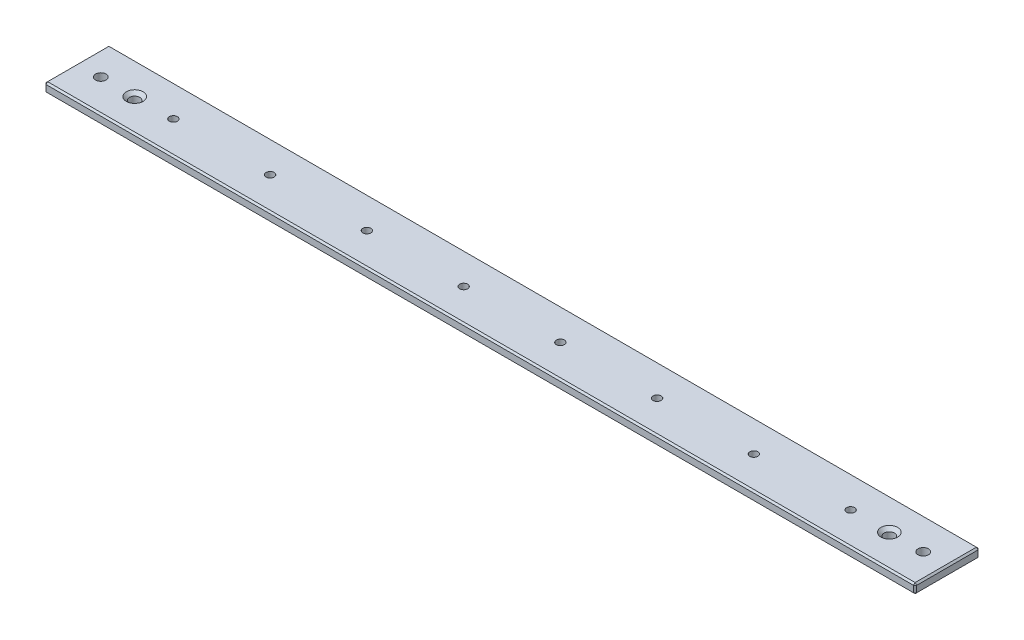
ISO-10303-21;
HEADER;
FILE_DESCRIPTION(('STEP AP214'),'2;1');
FILE_NAME('part.step','',(''),(''),'','','');
FILE_SCHEMA(('AUTOMOTIVE_DESIGN { 1 0 10303 214 1 1 1 1 }'));
ENDSEC;
DATA;
#1=APPLICATION_CONTEXT('core data for automotive mechanical design processes');
#2=APPLICATION_PROTOCOL_DEFINITION('international standard','automotive_design',2000,#1);
#3=PRODUCT_CONTEXT('',#1,'mechanical');
#4=PRODUCT('Part','Part','',(#3));
#5=PRODUCT_RELATED_PRODUCT_CATEGORY('part','',(#4));
#6=PRODUCT_DEFINITION_FORMATION('','',#4);
#7=PRODUCT_DEFINITION_CONTEXT('part definition',#1,'design');
#8=PRODUCT_DEFINITION('design','',#6,#7);
#9=PRODUCT_DEFINITION_SHAPE('','',#8);
#10=(LENGTH_UNIT() NAMED_UNIT(*) SI_UNIT(.MILLI.,.METRE.));
#11=(NAMED_UNIT(*) PLANE_ANGLE_UNIT() SI_UNIT($,.RADIAN.));
#12=(NAMED_UNIT(*) SI_UNIT($,.STERADIAN.) SOLID_ANGLE_UNIT());
#13=UNCERTAINTY_MEASURE_WITH_UNIT(LENGTH_MEASURE(1.E-05),#10,'distance_accuracy_value','');
#14=(GEOMETRIC_REPRESENTATION_CONTEXT(3) GLOBAL_UNCERTAINTY_ASSIGNED_CONTEXT((#13)) GLOBAL_UNIT_ASSIGNED_CONTEXT((#10,
#11,#12)) REPRESENTATION_CONTEXT('',''));
#15=CARTESIAN_POINT('',(0.,0.,0.));
#16=DIRECTION('',(0.,0.,1.));
#17=DIRECTION('',(1.,0.,0.));
#18=AXIS2_PLACEMENT_3D('',#15,#16,#17);
#19=CARTESIAN_POINT('',(135.,3.,-10.));
#20=DIRECTION('',(-1.,0.,0.));
#21=DIRECTION('',(0.,0.,1.));
#22=AXIS2_PLACEMENT_3D('',#19,#20,#21);
#23=PLANE('',#22);
#24=DIRECTION('',(0.,-1.,0.));
#25=VECTOR('',#24,1.);
#26=CARTESIAN_POINT('',(135.,3.,9.5));
#27=LINE('',#26,#25);
#28=CARTESIAN_POINT('',(135.,2.5,9.5));
#29=VERTEX_POINT('',#28);
#30=CARTESIAN_POINT('',(135.,0.5,9.5));
#31=VERTEX_POINT('',#30);
#32=EDGE_CURVE('E176',#29,#31,#27,.T.);
#33=ORIENTED_EDGE('',*,*,#32,.T.);
#34=DIRECTION('',(0.,0.,-1.));
#35=VECTOR('',#34,1.);
#36=CARTESIAN_POINT('',(135.,0.5,-10.));
#37=LINE('',#36,#35);
#38=CARTESIAN_POINT('',(135.,0.5,-9.5));
#39=VERTEX_POINT('',#38);
#40=EDGE_CURVE('E181',#31,#39,#37,.T.);
#41=ORIENTED_EDGE('',*,*,#40,.T.);
#42=DIRECTION('',(0.,1.,0.));
#43=VECTOR('',#42,1.);
#44=CARTESIAN_POINT('',(135.,3.,-9.5));
#45=LINE('',#44,#43);
#46=CARTESIAN_POINT('',(135.,2.5,-9.5));
#47=VERTEX_POINT('',#46);
#48=EDGE_CURVE('E178',#39,#47,#45,.T.);
#49=ORIENTED_EDGE('',*,*,#48,.T.);
#50=DIRECTION('',(0.,0.,1.));
#51=VECTOR('',#50,1.);
#52=CARTESIAN_POINT('',(135.,2.5,10.));
#53=LINE('',#52,#51);
#54=EDGE_CURVE('E174',#47,#29,#53,.T.);
#55=ORIENTED_EDGE('',*,*,#54,.T.);
#56=EDGE_LOOP('',(#33,#41,#49,#55));
#57=FACE_BOUND('',#56,.T.);
#58=ADVANCED_FACE('F38',(#57),#23,.F.);
#59=CARTESIAN_POINT('',(-135.,3.,-10.));
#60=DIRECTION('',(0.,0.,1.));
#61=DIRECTION('',(1.,0.,0.));
#62=AXIS2_PLACEMENT_3D('',#59,#60,#61);
#63=PLANE('',#62);
#64=DIRECTION('',(0.,-1.,0.));
#65=VECTOR('',#64,1.);
#66=CARTESIAN_POINT('',(134.5,3.,-10.));
#67=LINE('',#66,#65);
#68=CARTESIAN_POINT('',(134.5,2.5,-10.));
#69=VERTEX_POINT('',#68);
#70=CARTESIAN_POINT('',(134.5,0.5,-10.));
#71=VERTEX_POINT('',#70);
#72=EDGE_CURVE('E139',#69,#71,#67,.T.);
#73=ORIENTED_EDGE('',*,*,#72,.T.);
#74=DIRECTION('',(-1.,0.,0.));
#75=VECTOR('',#74,1.);
#76=CARTESIAN_POINT('',(-135.,0.5,-10.));
#77=LINE('',#76,#75);
#78=CARTESIAN_POINT('',(-134.5,0.5,-10.));
#79=VERTEX_POINT('',#78);
#80=EDGE_CURVE('E135',#71,#79,#77,.T.);
#81=ORIENTED_EDGE('',*,*,#80,.T.);
#82=DIRECTION('',(0.,1.,0.));
#83=VECTOR('',#82,1.);
#84=CARTESIAN_POINT('',(-134.5,3.,-10.));
#85=LINE('',#84,#83);
#86=CARTESIAN_POINT('',(-134.5,2.5,-10.));
#87=VERTEX_POINT('',#86);
#88=EDGE_CURVE('E127',#79,#87,#85,.T.);
#89=ORIENTED_EDGE('',*,*,#88,.T.);
#90=DIRECTION('',(1.,0.,0.));
#91=VECTOR('',#90,1.);
#92=CARTESIAN_POINT('',(135.,2.5,-10.));
#93=LINE('',#92,#91);
#94=EDGE_CURVE('E132',#87,#69,#93,.T.);
#95=ORIENTED_EDGE('',*,*,#94,.T.);
#96=EDGE_LOOP('',(#73,#81,#89,#95));
#97=FACE_BOUND('',#96,.T.);
#98=ADVANCED_FACE('F130',(#97),#63,.F.);
#99=CARTESIAN_POINT('',(-135.,3.,-10.));
#100=DIRECTION('',(1.,0.,0.));
#101=DIRECTION('',(0.,0.,-1.));
#102=AXIS2_PLACEMENT_3D('',#99,#100,#101);
#103=PLANE('',#102);
#104=DIRECTION('',(0.,0.,-1.));
#105=VECTOR('',#104,1.);
#106=CARTESIAN_POINT('',(-135.,2.5,-10.));
#107=LINE('',#106,#105);
#108=CARTESIAN_POINT('',(-135.,2.5,9.5));
#109=VERTEX_POINT('',#108);
#110=CARTESIAN_POINT('',(-135.,2.5,-9.5));
#111=VERTEX_POINT('',#110);
#112=EDGE_CURVE('E192',#109,#111,#107,.T.);
#113=ORIENTED_EDGE('',*,*,#112,.T.);
#114=DIRECTION('',(0.,-1.,0.));
#115=VECTOR('',#114,1.);
#116=CARTESIAN_POINT('',(-135.,3.,-9.5));
#117=LINE('',#116,#115);
#118=CARTESIAN_POINT('',(-135.,0.5,-9.5));
#119=VERTEX_POINT('',#118);
#120=EDGE_CURVE('E147',#111,#119,#117,.T.);
#121=ORIENTED_EDGE('',*,*,#120,.T.);
#122=DIRECTION('',(0.,0.,1.));
#123=VECTOR('',#122,1.);
#124=CARTESIAN_POINT('',(-135.,0.5,-10.));
#125=LINE('',#124,#123);
#126=CARTESIAN_POINT('',(-135.,0.5,9.5));
#127=VERTEX_POINT('',#126);
#128=EDGE_CURVE('E196',#119,#127,#125,.T.);
#129=ORIENTED_EDGE('',*,*,#128,.T.);
#130=DIRECTION('',(0.,1.,0.));
#131=VECTOR('',#130,1.);
#132=CARTESIAN_POINT('',(-135.,3.,9.5));
#133=LINE('',#132,#131);
#134=EDGE_CURVE('E194',#127,#109,#133,.T.);
#135=ORIENTED_EDGE('',*,*,#134,.T.);
#136=EDGE_LOOP('',(#113,#121,#129,#135));
#137=FACE_BOUND('',#136,.T.);
#138=ADVANCED_FACE('F366',(#137),#103,.F.);
#139=CARTESIAN_POINT('',(-135.,3.,10.));
#140=DIRECTION('',(0.,0.,-1.));
#141=DIRECTION('',(-1.,0.,0.));
#142=AXIS2_PLACEMENT_3D('',#139,#140,#141);
#143=PLANE('',#142);
#144=DIRECTION('',(1.,0.,0.));
#145=VECTOR('',#144,1.);
#146=CARTESIAN_POINT('',(-135.,0.5,10.));
#147=LINE('',#146,#145);
#148=CARTESIAN_POINT('',(-134.5,0.5,10.));
#149=VERTEX_POINT('',#148);
#150=CARTESIAN_POINT('',(134.5,0.5,10.));
#151=VERTEX_POINT('',#150);
#152=EDGE_CURVE('E187',#149,#151,#147,.T.);
#153=ORIENTED_EDGE('',*,*,#152,.T.);
#154=DIRECTION('',(0.,1.,0.));
#155=VECTOR('',#154,1.);
#156=CARTESIAN_POINT('',(134.5,3.,10.));
#157=LINE('',#156,#155);
#158=CARTESIAN_POINT('',(134.5,2.5,10.));
#159=VERTEX_POINT('',#158);
#160=EDGE_CURVE('E189',#151,#159,#157,.T.);
#161=ORIENTED_EDGE('',*,*,#160,.T.);
#162=DIRECTION('',(-1.,0.,0.));
#163=VECTOR('',#162,1.);
#164=CARTESIAN_POINT('',(-135.,2.5,10.));
#165=LINE('',#164,#163);
#166=CARTESIAN_POINT('',(-134.5,2.5,10.));
#167=VERTEX_POINT('',#166);
#168=EDGE_CURVE('E183',#159,#167,#165,.T.);
#169=ORIENTED_EDGE('',*,*,#168,.T.);
#170=DIRECTION('',(0.,-1.,0.));
#171=VECTOR('',#170,1.);
#172=CARTESIAN_POINT('',(-134.5,3.,10.));
#173=LINE('',#172,#171);
#174=EDGE_CURVE('E185',#167,#149,#173,.T.);
#175=ORIENTED_EDGE('',*,*,#174,.T.);
#176=EDGE_LOOP('',(#153,#161,#169,#175));
#177=FACE_BOUND('',#176,.T.);
#178=ADVANCED_FACE('F358',(#177),#143,.F.);
#179=CARTESIAN_POINT('',(0.,3.,0.));
#180=DIRECTION('',(0.,1.,0.));
#181=DIRECTION('',(0.,0.,1.));
#182=AXIS2_PLACEMENT_3D('',#179,#180,#181);
#183=PLANE('',#182);
#184=CARTESIAN_POINT('',(117.,3.,0.));
#185=DIRECTION('',(0.,1.,0.));
#186=DIRECTION('',(0.,0.,1.));
#187=AXIS2_PLACEMENT_3D('',#184,#185,#186);
#188=CIRCLE('',#187,2.60000000000002);
#189=CARTESIAN_POINT('',(117.,3.,2.60000000000002));
#190=VERTEX_POINT('',#189);
#191=EDGE_CURVE('E47',#190,#190,#188,.F.);
#192=ORIENTED_EDGE('',*,*,#191,.T.);
#193=EDGE_LOOP('',(#192));
#194=FACE_BOUND('',#193,.T.);
#195=CARTESIAN_POINT('',(-117.,3.,0.));
#196=DIRECTION('',(0.,1.,0.));
#197=DIRECTION('',(0.,0.,1.));
#198=AXIS2_PLACEMENT_3D('',#195,#196,#197);
#199=CIRCLE('',#198,2.60000000000002);
#200=CARTESIAN_POINT('',(-117.,3.,2.60000000000002));
#201=VERTEX_POINT('',#200);
#202=EDGE_CURVE('E272',#201,#201,#199,.F.);
#203=ORIENTED_EDGE('',*,*,#202,.T.);
#204=EDGE_LOOP('',(#203));
#205=FACE_BOUND('',#204,.T.);
#206=DIRECTION('',(1.,0.,0.));
#207=VECTOR('',#206,1.);
#208=CARTESIAN_POINT('',(135.,3.,9.5));
#209=LINE('',#208,#207);
#210=CARTESIAN_POINT('',(-134.5,3.,9.5));
#211=VERTEX_POINT('',#210);
#212=CARTESIAN_POINT('',(134.5,3.,9.5));
#213=VERTEX_POINT('',#212);
#214=EDGE_CURVE('E54',#211,#213,#209,.T.);
#215=ORIENTED_EDGE('',*,*,#214,.T.);
#216=DIRECTION('',(0.,0.,-1.));
#217=VECTOR('',#216,1.);
#218=CARTESIAN_POINT('',(134.5,3.,-10.));
#219=LINE('',#218,#217);
#220=CARTESIAN_POINT('',(134.5,3.,-9.5));
#221=VERTEX_POINT('',#220);
#222=EDGE_CURVE('E212',#213,#221,#219,.T.);
#223=ORIENTED_EDGE('',*,*,#222,.T.);
#224=DIRECTION('',(-1.,0.,0.));
#225=VECTOR('',#224,1.);
#226=CARTESIAN_POINT('',(-135.,3.,-9.5));
#227=LINE('',#226,#225);
#228=CARTESIAN_POINT('',(-134.5,3.,-9.5));
#229=VERTEX_POINT('',#228);
#230=EDGE_CURVE('E208',#221,#229,#227,.T.);
#231=ORIENTED_EDGE('',*,*,#230,.T.);
#232=DIRECTION('',(0.,0.,1.));
#233=VECTOR('',#232,1.);
#234=CARTESIAN_POINT('',(-134.5,3.,10.));
#235=LINE('',#234,#233);
#236=EDGE_CURVE('E59',#229,#211,#235,.T.);
#237=ORIENTED_EDGE('',*,*,#236,.T.);
#238=EDGE_LOOP('',(#215,#223,#231,#237));
#239=FACE_BOUND('',#238,.T.);
#240=CARTESIAN_POINT('',(-127.5,3.,0.));
#241=DIRECTION('',(0.,1.,0.));
#242=DIRECTION('',(0.,0.,1.));
#243=AXIS2_PLACEMENT_3D('',#240,#241,#242);
#244=CIRCLE('',#243,1.625);
#245=CARTESIAN_POINT('',(-127.5,3.,1.625));
#246=VERTEX_POINT('',#245);
#247=EDGE_CURVE('E303',#246,#246,#244,.T.);
#248=ORIENTED_EDGE('',*,*,#247,.F.);
#249=EDGE_LOOP('',(#248));
#250=FACE_BOUND('',#249,.T.);
#251=CARTESIAN_POINT('',(127.5,3.,0.));
#252=DIRECTION('',(0.,1.,0.));
#253=DIRECTION('',(0.,0.,1.));
#254=AXIS2_PLACEMENT_3D('',#251,#252,#253);
#255=CIRCLE('',#254,1.62499999999998);
#256=CARTESIAN_POINT('',(127.5,3.,1.62499999999997));
#257=VERTEX_POINT('',#256);
#258=EDGE_CURVE('E269',#257,#257,#255,.T.);
#259=ORIENTED_EDGE('',*,*,#258,.F.);
#260=EDGE_LOOP('',(#259));
#261=FACE_BOUND('',#260,.T.);
#262=CARTESIAN_POINT('',(-105.,3.,0.));
#263=DIRECTION('',(0.,1.,0.));
#264=DIRECTION('',(0.,0.,1.));
#265=AXIS2_PLACEMENT_3D('',#262,#263,#264);
#266=CIRCLE('',#265,1.24999999999999);
#267=CARTESIAN_POINT('',(-105.,3.,1.24999999999999));
#268=VERTEX_POINT('',#267);
#269=EDGE_CURVE('E302',#268,#268,#266,.T.);
#270=ORIENTED_EDGE('',*,*,#269,.F.);
#271=EDGE_LOOP('',(#270));
#272=FACE_BOUND('',#271,.T.);
#273=CARTESIAN_POINT('',(-75.0000000000001,3.,0.));
#274=DIRECTION('',(0.,1.,0.));
#275=DIRECTION('',(0.,0.,1.));
#276=AXIS2_PLACEMENT_3D('',#273,#274,#275);
#277=CIRCLE('',#276,1.24999999999999);
#278=CARTESIAN_POINT('',(-75.0000000000001,3.,1.24999999999999));
#279=VERTEX_POINT('',#278);
#280=EDGE_CURVE('E316',#279,#279,#277,.T.);
#281=ORIENTED_EDGE('',*,*,#280,.F.);
#282=EDGE_LOOP('',(#281));
#283=FACE_BOUND('',#282,.T.);
#284=CARTESIAN_POINT('',(-45.0000000000001,3.,0.));
#285=DIRECTION('',(0.,1.,0.));
#286=DIRECTION('',(0.,0.,1.));
#287=AXIS2_PLACEMENT_3D('',#284,#285,#286);
#288=CIRCLE('',#287,1.24999999999999);
#289=CARTESIAN_POINT('',(-45.0000000000001,3.,1.24999999999999));
#290=VERTEX_POINT('',#289);
#291=EDGE_CURVE('E322',#290,#290,#288,.T.);
#292=ORIENTED_EDGE('',*,*,#291,.F.);
#293=EDGE_LOOP('',(#292));
#294=FACE_BOUND('',#293,.T.);
#295=CARTESIAN_POINT('',(-15.0000000000001,3.,0.));
#296=DIRECTION('',(0.,1.,0.));
#297=DIRECTION('',(0.,0.,1.));
#298=AXIS2_PLACEMENT_3D('',#295,#296,#297);
#299=CIRCLE('',#298,1.24999999999999);
#300=CARTESIAN_POINT('',(-15.0000000000001,3.,1.24999999999999));
#301=VERTEX_POINT('',#300);
#302=EDGE_CURVE('E328',#301,#301,#299,.T.);
#303=ORIENTED_EDGE('',*,*,#302,.F.);
#304=EDGE_LOOP('',(#303));
#305=FACE_BOUND('',#304,.T.);
#306=CARTESIAN_POINT('',(14.9999999999999,3.,0.));
#307=DIRECTION('',(0.,1.,0.));
#308=DIRECTION('',(0.,0.,1.));
#309=AXIS2_PLACEMENT_3D('',#306,#307,#308);
#310=CIRCLE('',#309,1.24999999999999);
#311=CARTESIAN_POINT('',(14.9999999999999,3.,1.24999999999999));
#312=VERTEX_POINT('',#311);
#313=EDGE_CURVE('E334',#312,#312,#310,.T.);
#314=ORIENTED_EDGE('',*,*,#313,.F.);
#315=EDGE_LOOP('',(#314));
#316=FACE_BOUND('',#315,.T.);
#317=CARTESIAN_POINT('',(44.9999999999999,3.,0.));
#318=DIRECTION('',(0.,1.,0.));
#319=DIRECTION('',(0.,0.,1.));
#320=AXIS2_PLACEMENT_3D('',#317,#318,#319);
#321=CIRCLE('',#320,1.24999999999999);
#322=CARTESIAN_POINT('',(44.9999999999999,3.,1.24999999999999));
#323=VERTEX_POINT('',#322);
#324=EDGE_CURVE('E340',#323,#323,#321,.T.);
#325=ORIENTED_EDGE('',*,*,#324,.F.);
#326=EDGE_LOOP('',(#325));
#327=FACE_BOUND('',#326,.T.);
#328=CARTESIAN_POINT('',(74.9999999999999,3.,0.));
#329=DIRECTION('',(0.,1.,0.));
#330=DIRECTION('',(0.,0.,1.));
#331=AXIS2_PLACEMENT_3D('',#328,#329,#330);
#332=CIRCLE('',#331,1.24999999999999);
#333=CARTESIAN_POINT('',(74.9999999999999,3.,1.24999999999999));
#334=VERTEX_POINT('',#333);
#335=EDGE_CURVE('E346',#334,#334,#332,.T.);
#336=ORIENTED_EDGE('',*,*,#335,.F.);
#337=EDGE_LOOP('',(#336));
#338=FACE_BOUND('',#337,.T.);
#339=CARTESIAN_POINT('',(105.,3.,0.));
#340=DIRECTION('',(0.,1.,0.));
#341=DIRECTION('',(0.,0.,1.));
#342=AXIS2_PLACEMENT_3D('',#339,#340,#341);
#343=CIRCLE('',#342,1.24999999999999);
#344=CARTESIAN_POINT('',(105.,3.,1.24999999999999));
#345=VERTEX_POINT('',#344);
#346=EDGE_CURVE('E168',#345,#345,#343,.T.);
#347=ORIENTED_EDGE('',*,*,#346,.F.);
#348=EDGE_LOOP('',(#347));
#349=FACE_BOUND('',#348,.T.);
#350=ADVANCED_FACE('F277',(#194,#205,#239,#250,#261,#272,#283,#294,#305,#316,#327,#338,#349),
#183,.T.);
#351=CARTESIAN_POINT('',(0.,0.,0.));
#352=DIRECTION('',(0.,1.,0.));
#353=DIRECTION('',(0.,0.,1.));
#354=AXIS2_PLACEMENT_3D('',#351,#352,#353);
#355=PLANE('',#354);
#356=CARTESIAN_POINT('',(-117.,0.,0.));
#357=DIRECTION('',(0.,1.,0.));
#358=DIRECTION('',(0.,0.,1.));
#359=AXIS2_PLACEMENT_3D('',#356,#357,#358);
#360=CIRCLE('',#359,1.60000000000001);
#361=CARTESIAN_POINT('',(-117.,0.,1.60000000000001));
#362=VERTEX_POINT('',#361);
#363=EDGE_CURVE('E218',#362,#362,#360,.T.);
#364=ORIENTED_EDGE('',*,*,#363,.T.);
#365=EDGE_LOOP('',(#364));
#366=FACE_BOUND('',#365,.T.);
#367=CARTESIAN_POINT('',(117.,0.,0.));
#368=DIRECTION('',(0.,1.,0.));
#369=DIRECTION('',(0.,0.,1.));
#370=AXIS2_PLACEMENT_3D('',#367,#368,#369);
#371=CIRCLE('',#370,1.60000000000001);
#372=CARTESIAN_POINT('',(117.,0.,1.60000000000001));
#373=VERTEX_POINT('',#372);
#374=EDGE_CURVE('E293',#373,#373,#371,.T.);
#375=ORIENTED_EDGE('',*,*,#374,.T.);
#376=EDGE_LOOP('',(#375));
#377=FACE_BOUND('',#376,.T.);
#378=DIRECTION('',(-1.,0.,0.));
#379=VECTOR('',#378,1.);
#380=CARTESIAN_POINT('',(0.,0.,9.5));
#381=LINE('',#380,#379);
#382=CARTESIAN_POINT('',(134.5,0.,9.5));
#383=VERTEX_POINT('',#382);
#384=CARTESIAN_POINT('',(-134.5,0.,9.5));
#385=VERTEX_POINT('',#384);
#386=EDGE_CURVE('E199',#383,#385,#381,.T.);
#387=ORIENTED_EDGE('',*,*,#386,.T.);
#388=DIRECTION('',(0.,0.,-1.));
#389=VECTOR('',#388,1.);
#390=CARTESIAN_POINT('',(-134.5,0.,0.));
#391=LINE('',#390,#389);
#392=CARTESIAN_POINT('',(-134.5,0.,-9.5));
#393=VERTEX_POINT('',#392);
#394=EDGE_CURVE('E205',#385,#393,#391,.T.);
#395=ORIENTED_EDGE('',*,*,#394,.T.);
#396=DIRECTION('',(1.,0.,0.));
#397=VECTOR('',#396,1.);
#398=CARTESIAN_POINT('',(0.,0.,-9.5));
#399=LINE('',#398,#397);
#400=CARTESIAN_POINT('',(134.5,0.,-9.5));
#401=VERTEX_POINT('',#400);
#402=EDGE_CURVE('E203',#393,#401,#399,.T.);
#403=ORIENTED_EDGE('',*,*,#402,.T.);
#404=DIRECTION('',(0.,0.,1.));
#405=VECTOR('',#404,1.);
#406=CARTESIAN_POINT('',(134.5,0.,0.));
#407=LINE('',#406,#405);
#408=EDGE_CURVE('E201',#401,#383,#407,.T.);
#409=ORIENTED_EDGE('',*,*,#408,.T.);
#410=EDGE_LOOP('',(#387,#395,#403,#409));
#411=FACE_BOUND('',#410,.T.);
#412=CARTESIAN_POINT('',(-127.5,0.,0.));
#413=DIRECTION('',(0.,1.,0.));
#414=DIRECTION('',(0.,0.,1.));
#415=AXIS2_PLACEMENT_3D('',#412,#413,#414);
#416=CIRCLE('',#415,1.625);
#417=CARTESIAN_POINT('',(-127.5,0.,1.625));
#418=VERTEX_POINT('',#417);
#419=EDGE_CURVE('E299',#418,#418,#416,.T.);
#420=ORIENTED_EDGE('',*,*,#419,.T.);
#421=EDGE_LOOP('',(#420));
#422=FACE_BOUND('',#421,.T.);
#423=CARTESIAN_POINT('',(127.5,0.,0.));
#424=DIRECTION('',(0.,1.,0.));
#425=DIRECTION('',(0.,0.,1.));
#426=AXIS2_PLACEMENT_3D('',#423,#424,#425);
#427=CIRCLE('',#426,1.62499999999998);
#428=CARTESIAN_POINT('',(127.5,0.,1.62499999999997));
#429=VERTEX_POINT('',#428);
#430=EDGE_CURVE('E306',#429,#429,#427,.T.);
#431=ORIENTED_EDGE('',*,*,#430,.T.);
#432=EDGE_LOOP('',(#431));
#433=FACE_BOUND('',#432,.T.);
#434=CARTESIAN_POINT('',(-105.,0.,0.));
#435=DIRECTION('',(0.,1.,0.));
#436=DIRECTION('',(0.,0.,1.));
#437=AXIS2_PLACEMENT_3D('',#434,#435,#436);
#438=CIRCLE('',#437,1.25);
#439=CARTESIAN_POINT('',(-105.,0.,1.25));
#440=VERTEX_POINT('',#439);
#441=EDGE_CURVE('E313',#440,#440,#438,.T.);
#442=ORIENTED_EDGE('',*,*,#441,.T.);
#443=EDGE_LOOP('',(#442));
#444=FACE_BOUND('',#443,.T.);
#445=CARTESIAN_POINT('',(-75.0000000000001,0.,0.));
#446=DIRECTION('',(0.,1.,0.));
#447=DIRECTION('',(0.,0.,1.));
#448=AXIS2_PLACEMENT_3D('',#445,#446,#447);
#449=CIRCLE('',#448,1.25);
#450=CARTESIAN_POINT('',(-75.0000000000001,0.,1.25));
#451=VERTEX_POINT('',#450);
#452=EDGE_CURVE('E319',#451,#451,#449,.T.);
#453=ORIENTED_EDGE('',*,*,#452,.T.);
#454=EDGE_LOOP('',(#453));
#455=FACE_BOUND('',#454,.T.);
#456=CARTESIAN_POINT('',(-45.0000000000001,0.,0.));
#457=DIRECTION('',(0.,1.,0.));
#458=DIRECTION('',(0.,0.,1.));
#459=AXIS2_PLACEMENT_3D('',#456,#457,#458);
#460=CIRCLE('',#459,1.25);
#461=CARTESIAN_POINT('',(-45.0000000000001,0.,1.25));
#462=VERTEX_POINT('',#461);
#463=EDGE_CURVE('E325',#462,#462,#460,.T.);
#464=ORIENTED_EDGE('',*,*,#463,.T.);
#465=EDGE_LOOP('',(#464));
#466=FACE_BOUND('',#465,.T.);
#467=CARTESIAN_POINT('',(-15.0000000000001,0.,0.));
#468=DIRECTION('',(0.,1.,0.));
#469=DIRECTION('',(0.,0.,1.));
#470=AXIS2_PLACEMENT_3D('',#467,#468,#469);
#471=CIRCLE('',#470,1.25);
#472=CARTESIAN_POINT('',(-15.0000000000001,0.,1.25));
#473=VERTEX_POINT('',#472);
#474=EDGE_CURVE('E331',#473,#473,#471,.T.);
#475=ORIENTED_EDGE('',*,*,#474,.T.);
#476=EDGE_LOOP('',(#475));
#477=FACE_BOUND('',#476,.T.);
#478=CARTESIAN_POINT('',(14.9999999999999,0.,0.));
#479=DIRECTION('',(0.,1.,0.));
#480=DIRECTION('',(0.,0.,1.));
#481=AXIS2_PLACEMENT_3D('',#478,#479,#480);
#482=CIRCLE('',#481,1.25);
#483=CARTESIAN_POINT('',(14.9999999999999,0.,1.25));
#484=VERTEX_POINT('',#483);
#485=EDGE_CURVE('E337',#484,#484,#482,.T.);
#486=ORIENTED_EDGE('',*,*,#485,.T.);
#487=EDGE_LOOP('',(#486));
#488=FACE_BOUND('',#487,.T.);
#489=CARTESIAN_POINT('',(44.9999999999999,0.,0.));
#490=DIRECTION('',(0.,1.,0.));
#491=DIRECTION('',(0.,0.,1.));
#492=AXIS2_PLACEMENT_3D('',#489,#490,#491);
#493=CIRCLE('',#492,1.25);
#494=CARTESIAN_POINT('',(44.9999999999999,0.,1.25));
#495=VERTEX_POINT('',#494);
#496=EDGE_CURVE('E343',#495,#495,#493,.T.);
#497=ORIENTED_EDGE('',*,*,#496,.T.);
#498=EDGE_LOOP('',(#497));
#499=FACE_BOUND('',#498,.T.);
#500=CARTESIAN_POINT('',(74.9999999999999,0.,0.));
#501=DIRECTION('',(0.,1.,0.));
#502=DIRECTION('',(0.,0.,1.));
#503=AXIS2_PLACEMENT_3D('',#500,#501,#502);
#504=CIRCLE('',#503,1.25);
#505=CARTESIAN_POINT('',(74.9999999999999,0.,1.25));
#506=VERTEX_POINT('',#505);
#507=EDGE_CURVE('E349',#506,#506,#504,.T.);
#508=ORIENTED_EDGE('',*,*,#507,.T.);
#509=EDGE_LOOP('',(#508));
#510=FACE_BOUND('',#509,.T.);
#511=CARTESIAN_POINT('',(105.,0.,0.));
#512=DIRECTION('',(0.,1.,0.));
#513=DIRECTION('',(0.,0.,1.));
#514=AXIS2_PLACEMENT_3D('',#511,#512,#513);
#515=CIRCLE('',#514,1.25);
#516=CARTESIAN_POINT('',(105.,0.,1.25));
#517=VERTEX_POINT('',#516);
#518=EDGE_CURVE('E165',#517,#517,#515,.T.);
#519=ORIENTED_EDGE('',*,*,#518,.T.);
#520=EDGE_LOOP('',(#519));
#521=FACE_BOUND('',#520,.T.);
#522=ADVANCED_FACE('F357',(#366,#377,#411,#422,#433,#444,#455,#466,#477,#488,#499,#510,#521),
#355,.F.);
#523=CARTESIAN_POINT('',(105.,3.,0.));
#524=DIRECTION('',(0.,1.,0.));
#525=DIRECTION('',(0.,0.,1.));
#526=AXIS2_PLACEMENT_3D('',#523,#524,#525);
#527=CYLINDRICAL_SURFACE('',#526,1.24999999999999);
#528=ORIENTED_EDGE('',*,*,#518,.F.);
#529=EDGE_LOOP('',(#528));
#530=FACE_BOUND('',#529,.T.);
#531=ORIENTED_EDGE('',*,*,#346,.T.);
#532=EDGE_LOOP('',(#531));
#533=FACE_BOUND('',#532,.T.);
#534=ADVANCED_FACE('F354',(#530,#533),#527,.F.);
#535=CARTESIAN_POINT('',(74.9999999999999,3.,0.));
#536=DIRECTION('',(0.,1.,0.));
#537=DIRECTION('',(0.,0.,1.));
#538=AXIS2_PLACEMENT_3D('',#535,#536,#537);
#539=CYLINDRICAL_SURFACE('',#538,1.24999999999999);
#540=ORIENTED_EDGE('',*,*,#507,.F.);
#541=EDGE_LOOP('',(#540));
#542=FACE_BOUND('',#541,.T.);
#543=ORIENTED_EDGE('',*,*,#335,.T.);
#544=EDGE_LOOP('',(#543));
#545=FACE_BOUND('',#544,.T.);
#546=ADVANCED_FACE('F568',(#542,#545),#539,.F.);
#547=CARTESIAN_POINT('',(44.9999999999999,3.,0.));
#548=DIRECTION('',(0.,1.,0.));
#549=DIRECTION('',(0.,0.,1.));
#550=AXIS2_PLACEMENT_3D('',#547,#548,#549);
#551=CYLINDRICAL_SURFACE('',#550,1.24999999999999);
#552=ORIENTED_EDGE('',*,*,#496,.F.);
#553=EDGE_LOOP('',(#552));
#554=FACE_BOUND('',#553,.T.);
#555=ORIENTED_EDGE('',*,*,#324,.T.);
#556=EDGE_LOOP('',(#555));
#557=FACE_BOUND('',#556,.T.);
#558=ADVANCED_FACE('F570',(#554,#557),#551,.F.);
#559=CARTESIAN_POINT('',(14.9999999999999,3.,0.));
#560=DIRECTION('',(0.,1.,0.));
#561=DIRECTION('',(0.,0.,1.));
#562=AXIS2_PLACEMENT_3D('',#559,#560,#561);
#563=CYLINDRICAL_SURFACE('',#562,1.24999999999999);
#564=ORIENTED_EDGE('',*,*,#485,.F.);
#565=EDGE_LOOP('',(#564));
#566=FACE_BOUND('',#565,.T.);
#567=ORIENTED_EDGE('',*,*,#313,.T.);
#568=EDGE_LOOP('',(#567));
#569=FACE_BOUND('',#568,.T.);
#570=ADVANCED_FACE('F577',(#566,#569),#563,.F.);
#571=CARTESIAN_POINT('',(-15.0000000000001,3.,0.));
#572=DIRECTION('',(0.,1.,0.));
#573=DIRECTION('',(0.,0.,1.));
#574=AXIS2_PLACEMENT_3D('',#571,#572,#573);
#575=CYLINDRICAL_SURFACE('',#574,1.24999999999999);
#576=ORIENTED_EDGE('',*,*,#474,.F.);
#577=EDGE_LOOP('',(#576));
#578=FACE_BOUND('',#577,.T.);
#579=ORIENTED_EDGE('',*,*,#302,.T.);
#580=EDGE_LOOP('',(#579));
#581=FACE_BOUND('',#580,.T.);
#582=ADVANCED_FACE('F585',(#578,#581),#575,.F.);
#583=CARTESIAN_POINT('',(-45.0000000000001,3.,0.));
#584=DIRECTION('',(0.,1.,0.));
#585=DIRECTION('',(0.,0.,1.));
#586=AXIS2_PLACEMENT_3D('',#583,#584,#585);
#587=CYLINDRICAL_SURFACE('',#586,1.24999999999999);
#588=ORIENTED_EDGE('',*,*,#463,.F.);
#589=EDGE_LOOP('',(#588));
#590=FACE_BOUND('',#589,.T.);
#591=ORIENTED_EDGE('',*,*,#291,.T.);
#592=EDGE_LOOP('',(#591));
#593=FACE_BOUND('',#592,.T.);
#594=ADVANCED_FACE('F589',(#590,#593),#587,.F.);
#595=CARTESIAN_POINT('',(-75.0000000000001,3.,0.));
#596=DIRECTION('',(0.,1.,0.));
#597=DIRECTION('',(0.,0.,1.));
#598=AXIS2_PLACEMENT_3D('',#595,#596,#597);
#599=CYLINDRICAL_SURFACE('',#598,1.24999999999999);
#600=ORIENTED_EDGE('',*,*,#452,.F.);
#601=EDGE_LOOP('',(#600));
#602=FACE_BOUND('',#601,.T.);
#603=ORIENTED_EDGE('',*,*,#280,.T.);
#604=EDGE_LOOP('',(#603));
#605=FACE_BOUND('',#604,.T.);
#606=ADVANCED_FACE('F593',(#602,#605),#599,.F.);
#607=CARTESIAN_POINT('',(-105.,3.,0.));
#608=DIRECTION('',(0.,1.,0.));
#609=DIRECTION('',(0.,0.,1.));
#610=AXIS2_PLACEMENT_3D('',#607,#608,#609);
#611=CYLINDRICAL_SURFACE('',#610,1.24999999999999);
#612=ORIENTED_EDGE('',*,*,#441,.F.);
#613=EDGE_LOOP('',(#612));
#614=FACE_BOUND('',#613,.T.);
#615=ORIENTED_EDGE('',*,*,#269,.T.);
#616=EDGE_LOOP('',(#615));
#617=FACE_BOUND('',#616,.T.);
#618=ADVANCED_FACE('F597',(#614,#617),#611,.F.);
#619=CARTESIAN_POINT('',(127.5,0.,0.));
#620=DIRECTION('',(0.,1.,0.));
#621=DIRECTION('',(0.,0.,1.));
#622=AXIS2_PLACEMENT_3D('',#619,#620,#621);
#623=CYLINDRICAL_SURFACE('',#622,1.62499999999998);
#624=ORIENTED_EDGE('',*,*,#430,.F.);
#625=EDGE_LOOP('',(#624));
#626=FACE_BOUND('',#625,.T.);
#627=ORIENTED_EDGE('',*,*,#258,.T.);
#628=EDGE_LOOP('',(#627));
#629=FACE_BOUND('',#628,.T.);
#630=ADVANCED_FACE('F520',(#626,#629),#623,.F.);
#631=CARTESIAN_POINT('',(-127.5,0.,0.));
#632=DIRECTION('',(0.,1.,0.));
#633=DIRECTION('',(0.,0.,1.));
#634=AXIS2_PLACEMENT_3D('',#631,#632,#633);
#635=CYLINDRICAL_SURFACE('',#634,1.625);
#636=ORIENTED_EDGE('',*,*,#419,.F.);
#637=EDGE_LOOP('',(#636));
#638=FACE_BOUND('',#637,.T.);
#639=ORIENTED_EDGE('',*,*,#247,.T.);
#640=EDGE_LOOP('',(#639));
#641=FACE_BOUND('',#640,.T.);
#642=ADVANCED_FACE('F511',(#638,#641),#635,.F.);
#643=CARTESIAN_POINT('',(-134.5,3.,10.));
#644=DIRECTION('',(0.707106781186547,0.,-0.707106781186547));
#645=DIRECTION('',(0.,-1.,0.));
#646=AXIS2_PLACEMENT_3D('',#643,#644,#645);
#647=PLANE('',#646);
#648=DIRECTION('',(-0.707106781186547,0.,-0.707106781186547));
#649=VECTOR('',#648,1.);
#650=CARTESIAN_POINT('',(-135.,2.5,9.5));
#651=LINE('',#650,#649);
#652=EDGE_CURVE('E266',#109,#167,#651,.F.);
#653=ORIENTED_EDGE('',*,*,#652,.F.);
#654=ORIENTED_EDGE('',*,*,#134,.F.);
#655=DIRECTION('',(0.707106781186547,0.,0.707106781186547));
#656=VECTOR('',#655,1.);
#657=CARTESIAN_POINT('',(-135.,0.5,9.5));
#658=LINE('',#657,#656);
#659=EDGE_CURVE('E263',#149,#127,#658,.F.);
#660=ORIENTED_EDGE('',*,*,#659,.F.);
#661=ORIENTED_EDGE('',*,*,#174,.F.);
#662=EDGE_LOOP('',(#653,#654,#660,#661));
#663=FACE_BOUND('',#662,.T.);
#664=ADVANCED_FACE('F506',(#663),#647,.F.);
#665=CARTESIAN_POINT('',(-135.,2.5,9.5));
#666=DIRECTION('',(-0.577350269189626,0.577350269189626,0.577350269189626));
#667=DIRECTION('',(0.707106781186547,0.,0.707106781186547));
#668=AXIS2_PLACEMENT_3D('',#665,#666,#667);
#669=PLANE('',#668);
#670=DIRECTION('',(-0.707106781186547,-0.707106781186547,0.));
#671=VECTOR('',#670,1.);
#672=CARTESIAN_POINT('',(-135.,2.5,9.5));
#673=LINE('',#672,#671);
#674=EDGE_CURVE('E258',#109,#211,#673,.F.);
#675=ORIENTED_EDGE('',*,*,#674,.F.);
#676=ORIENTED_EDGE('',*,*,#652,.T.);
#677=DIRECTION('',(0.,0.707106781186547,-0.707106781186547));
#678=VECTOR('',#677,1.);
#679=CARTESIAN_POINT('',(-134.5,2.75,9.75));
#680=LINE('',#679,#678);
#681=EDGE_CURVE('E260',#211,#167,#680,.F.);
#682=ORIENTED_EDGE('',*,*,#681,.F.);
#683=EDGE_LOOP('',(#675,#676,#682));
#684=FACE_BOUND('',#683,.T.);
#685=ADVANCED_FACE('F499',(#684),#669,.T.);
#686=CARTESIAN_POINT('',(-135.,0.5,9.5));
#687=DIRECTION('',(-0.577350269189626,-0.577350269189626,0.577350269189626));
#688=DIRECTION('',(0.707106781186547,0.,0.707106781186547));
#689=AXIS2_PLACEMENT_3D('',#686,#687,#688);
#690=PLANE('',#689);
#691=DIRECTION('',(0.,-0.707106781186547,-0.707106781186547));
#692=VECTOR('',#691,1.);
#693=CARTESIAN_POINT('',(-134.5,0.25,9.75));
#694=LINE('',#693,#692);
#695=EDGE_CURVE('E252',#149,#385,#694,.T.);
#696=ORIENTED_EDGE('',*,*,#695,.F.);
#697=ORIENTED_EDGE('',*,*,#659,.T.);
#698=DIRECTION('',(-0.707106781186547,0.707106781186547,0.));
#699=VECTOR('',#698,1.);
#700=CARTESIAN_POINT('',(-135.,0.5,9.5));
#701=LINE('',#700,#699);
#702=EDGE_CURVE('E255',#385,#127,#701,.T.);
#703=ORIENTED_EDGE('',*,*,#702,.F.);
#704=EDGE_LOOP('',(#696,#697,#703));
#705=FACE_BOUND('',#704,.T.);
#706=ADVANCED_FACE('F492',(#705),#690,.T.);
#707=CARTESIAN_POINT('',(0.,3.,9.5));
#708=DIRECTION('',(0.,0.707106781186547,0.707106781186547));
#709=DIRECTION('',(-1.,0.,0.));
#710=AXIS2_PLACEMENT_3D('',#707,#708,#709);
#711=PLANE('',#710);
#712=ORIENTED_EDGE('',*,*,#681,.T.);
#713=ORIENTED_EDGE('',*,*,#168,.F.);
#714=DIRECTION('',(0.,-0.707106781186547,0.707106781186547));
#715=VECTOR('',#714,1.);
#716=CARTESIAN_POINT('',(134.5,2.5,10.));
#717=LINE('',#716,#715);
#718=EDGE_CURVE('E247',#213,#159,#717,.T.);
#719=ORIENTED_EDGE('',*,*,#718,.F.);
#720=ORIENTED_EDGE('',*,*,#214,.F.);
#721=EDGE_LOOP('',(#712,#713,#719,#720));
#722=FACE_BOUND('',#721,.T.);
#723=ADVANCED_FACE('F485',(#722),#711,.T.);
#724=CARTESIAN_POINT('',(-134.5,3.,0.));
#725=DIRECTION('',(-0.707106781186547,0.707106781186547,0.));
#726=DIRECTION('',(0.,0.,-1.));
#727=AXIS2_PLACEMENT_3D('',#724,#725,#726);
#728=PLANE('',#727);
#729=ORIENTED_EDGE('',*,*,#674,.T.);
#730=ORIENTED_EDGE('',*,*,#236,.F.);
#731=DIRECTION('',(0.707106781186547,0.707106781186547,0.));
#732=VECTOR('',#731,1.);
#733=CARTESIAN_POINT('',(-134.75,2.75,-9.5));
#734=LINE('',#733,#732);
#735=EDGE_CURVE('E151',#111,#229,#734,.T.);
#736=ORIENTED_EDGE('',*,*,#735,.F.);
#737=ORIENTED_EDGE('',*,*,#112,.F.);
#738=EDGE_LOOP('',(#729,#730,#736,#737));
#739=FACE_BOUND('',#738,.T.);
#740=ADVANCED_FACE('F479',(#739),#728,.T.);
#741=CARTESIAN_POINT('',(-135.,3.,-9.5));
#742=DIRECTION('',(0.707106781186547,0.,0.707106781186547));
#743=DIRECTION('',(0.,-1.,0.));
#744=AXIS2_PLACEMENT_3D('',#741,#742,#743);
#745=PLANE('',#744);
#746=DIRECTION('',(-0.707106781186547,0.,0.707106781186547));
#747=VECTOR('',#746,1.);
#748=CARTESIAN_POINT('',(-135.,0.5,-9.5));
#749=LINE('',#748,#747);
#750=EDGE_CURVE('E152',#119,#79,#749,.F.);
#751=ORIENTED_EDGE('',*,*,#750,.F.);
#752=ORIENTED_EDGE('',*,*,#120,.F.);
#753=DIRECTION('',(0.707106781186547,0.,-0.707106781186547));
#754=VECTOR('',#753,1.);
#755=CARTESIAN_POINT('',(-134.5,2.5,-10.));
#756=LINE('',#755,#754);
#757=EDGE_CURVE('E143',#87,#111,#756,.F.);
#758=ORIENTED_EDGE('',*,*,#757,.F.);
#759=ORIENTED_EDGE('',*,*,#88,.F.);
#760=EDGE_LOOP('',(#751,#752,#758,#759));
#761=FACE_BOUND('',#760,.T.);
#762=ADVANCED_FACE('F145',(#761),#745,.F.);
#763=CARTESIAN_POINT('',(-135.,0.5,-10.));
#764=DIRECTION('',(0.707106781186547,0.707106781186547,0.));
#765=DIRECTION('',(0.,0.,1.));
#766=AXIS2_PLACEMENT_3D('',#763,#764,#765);
#767=PLANE('',#766);
#768=ORIENTED_EDGE('',*,*,#702,.T.);
#769=ORIENTED_EDGE('',*,*,#128,.F.);
#770=DIRECTION('',(0.707106781186547,-0.707106781186547,0.));
#771=VECTOR('',#770,1.);
#772=CARTESIAN_POINT('',(-135.,0.5,-9.5));
#773=LINE('',#772,#771);
#774=EDGE_CURVE('E243',#393,#119,#773,.F.);
#775=ORIENTED_EDGE('',*,*,#774,.F.);
#776=ORIENTED_EDGE('',*,*,#394,.F.);
#777=EDGE_LOOP('',(#768,#769,#775,#776));
#778=FACE_BOUND('',#777,.T.);
#779=ADVANCED_FACE('F466',(#778),#767,.F.);
#780=CARTESIAN_POINT('',(-135.,0.5,10.));
#781=DIRECTION('',(0.,0.707106781186547,-0.707106781186547));
#782=DIRECTION('',(1.,0.,0.));
#783=AXIS2_PLACEMENT_3D('',#780,#781,#782);
#784=PLANE('',#783);
#785=ORIENTED_EDGE('',*,*,#695,.T.);
#786=ORIENTED_EDGE('',*,*,#386,.F.);
#787=DIRECTION('',(0.,0.707106781186547,0.707106781186547));
#788=VECTOR('',#787,1.);
#789=CARTESIAN_POINT('',(134.5,0.25,9.75));
#790=LINE('',#789,#788);
#791=EDGE_CURVE('E240',#151,#383,#790,.F.);
#792=ORIENTED_EDGE('',*,*,#791,.F.);
#793=ORIENTED_EDGE('',*,*,#152,.F.);
#794=EDGE_LOOP('',(#785,#786,#792,#793));
#795=FACE_BOUND('',#794,.T.);
#796=ADVANCED_FACE('F459',(#795),#784,.F.);
#797=CARTESIAN_POINT('',(135.,3.,9.5));
#798=DIRECTION('',(-0.707106781186547,0.,-0.707106781186547));
#799=DIRECTION('',(0.,-1.,0.));
#800=AXIS2_PLACEMENT_3D('',#797,#798,#799);
#801=PLANE('',#800);
#802=DIRECTION('',(-0.707106781186547,0.,0.707106781186547));
#803=VECTOR('',#802,1.);
#804=CARTESIAN_POINT('',(134.5,2.5,10.));
#805=LINE('',#804,#803);
#806=EDGE_CURVE('E249',#159,#29,#805,.F.);
#807=ORIENTED_EDGE('',*,*,#806,.F.);
#808=ORIENTED_EDGE('',*,*,#160,.F.);
#809=DIRECTION('',(0.707106781186547,0.,-0.707106781186547));
#810=VECTOR('',#809,1.);
#811=CARTESIAN_POINT('',(135.,0.5,9.5));
#812=LINE('',#811,#810);
#813=EDGE_CURVE('E237',#31,#151,#812,.F.);
#814=ORIENTED_EDGE('',*,*,#813,.F.);
#815=ORIENTED_EDGE('',*,*,#32,.F.);
#816=EDGE_LOOP('',(#807,#808,#814,#815));
#817=FACE_BOUND('',#816,.T.);
#818=ADVANCED_FACE('F452',(#817),#801,.F.);
#819=CARTESIAN_POINT('',(134.5,2.5,10.));
#820=DIRECTION('',(0.577350269189626,0.577350269189626,0.577350269189626));
#821=DIRECTION('',(0.707106781186547,0.,-0.707106781186547));
#822=AXIS2_PLACEMENT_3D('',#819,#820,#821);
#823=PLANE('',#822);
#824=ORIENTED_EDGE('',*,*,#718,.T.);
#825=ORIENTED_EDGE('',*,*,#806,.T.);
#826=DIRECTION('',(-0.707106781186547,0.707106781186547,0.));
#827=VECTOR('',#826,1.);
#828=CARTESIAN_POINT('',(134.75,2.75,9.5));
#829=LINE('',#828,#827);
#830=EDGE_CURVE('E159',#213,#29,#829,.F.);
#831=ORIENTED_EDGE('',*,*,#830,.F.);
#832=EDGE_LOOP('',(#824,#825,#831));
#833=FACE_BOUND('',#832,.T.);
#834=ADVANCED_FACE('F446',(#833),#823,.T.);
#835=CARTESIAN_POINT('',(-134.5,2.5,-10.));
#836=DIRECTION('',(-0.577350269189626,0.577350269189626,-0.577350269189626));
#837=DIRECTION('',(-0.707106781186547,0.,0.707106781186547));
#838=AXIS2_PLACEMENT_3D('',#835,#836,#837);
#839=PLANE('',#838);
#840=ORIENTED_EDGE('',*,*,#757,.T.);
#841=ORIENTED_EDGE('',*,*,#735,.T.);
#842=DIRECTION('',(0.,-0.707106781186547,-0.707106781186547));
#843=VECTOR('',#842,1.);
#844=CARTESIAN_POINT('',(-134.5,2.5,-10.));
#845=LINE('',#844,#843);
#846=EDGE_CURVE('E155',#87,#229,#845,.F.);
#847=ORIENTED_EDGE('',*,*,#846,.F.);
#848=EDGE_LOOP('',(#840,#841,#847));
#849=FACE_BOUND('',#848,.T.);
#850=ADVANCED_FACE('F156',(#849),#839,.T.);
#851=CARTESIAN_POINT('',(-135.,0.5,-9.5));
#852=DIRECTION('',(-0.577350269189626,-0.577350269189626,-0.577350269189626));
#853=DIRECTION('',(-0.707106781186547,0.,0.707106781186547));
#854=AXIS2_PLACEMENT_3D('',#851,#852,#853);
#855=PLANE('',#854);
#856=ORIENTED_EDGE('',*,*,#774,.T.);
#857=ORIENTED_EDGE('',*,*,#750,.T.);
#858=DIRECTION('',(0.,0.707106781186547,-0.707106781186547));
#859=VECTOR('',#858,1.);
#860=CARTESIAN_POINT('',(-134.5,0.25,-9.75));
#861=LINE('',#860,#859);
#862=EDGE_CURVE('E160',#393,#79,#861,.T.);
#863=ORIENTED_EDGE('',*,*,#862,.F.);
#864=EDGE_LOOP('',(#856,#857,#863));
#865=FACE_BOUND('',#864,.T.);
#866=ADVANCED_FACE('F433',(#865),#855,.T.);
#867=CARTESIAN_POINT('',(135.,0.5,9.5));
#868=DIRECTION('',(0.577350269189626,-0.577350269189626,0.577350269189626));
#869=DIRECTION('',(0.707106781186547,0.,-0.707106781186547));
#870=AXIS2_PLACEMENT_3D('',#867,#868,#869);
#871=PLANE('',#870);
#872=ORIENTED_EDGE('',*,*,#813,.T.);
#873=ORIENTED_EDGE('',*,*,#791,.T.);
#874=DIRECTION('',(-0.707106781186547,-0.707106781186547,0.));
#875=VECTOR('',#874,1.);
#876=CARTESIAN_POINT('',(135.,0.5,9.5));
#877=LINE('',#876,#875);
#878=EDGE_CURVE('E230',#31,#383,#877,.T.);
#879=ORIENTED_EDGE('',*,*,#878,.F.);
#880=EDGE_LOOP('',(#872,#873,#879));
#881=FACE_BOUND('',#880,.T.);
#882=ADVANCED_FACE('F426',(#881),#871,.T.);
#883=CARTESIAN_POINT('',(134.5,3.,0.));
#884=DIRECTION('',(0.707106781186547,0.707106781186547,0.));
#885=DIRECTION('',(0.,0.,1.));
#886=AXIS2_PLACEMENT_3D('',#883,#884,#885);
#887=PLANE('',#886);
#888=ORIENTED_EDGE('',*,*,#830,.T.);
#889=ORIENTED_EDGE('',*,*,#54,.F.);
#890=DIRECTION('',(0.707106781186547,-0.707106781186547,0.));
#891=VECTOR('',#890,1.);
#892=CARTESIAN_POINT('',(135.,2.5,-9.5));
#893=LINE('',#892,#891);
#894=EDGE_CURVE('E227',#221,#47,#893,.T.);
#895=ORIENTED_EDGE('',*,*,#894,.F.);
#896=ORIENTED_EDGE('',*,*,#222,.F.);
#897=EDGE_LOOP('',(#888,#889,#895,#896));
#898=FACE_BOUND('',#897,.T.);
#899=ADVANCED_FACE('F420',(#898),#887,.T.);
#900=CARTESIAN_POINT('',(0.,3.,-9.5));
#901=DIRECTION('',(0.,0.707106781186547,-0.707106781186547));
#902=DIRECTION('',(1.,0.,0.));
#903=AXIS2_PLACEMENT_3D('',#900,#901,#902);
#904=PLANE('',#903);
#905=ORIENTED_EDGE('',*,*,#846,.T.);
#906=ORIENTED_EDGE('',*,*,#230,.F.);
#907=DIRECTION('',(0.,0.707106781186547,0.707106781186547));
#908=VECTOR('',#907,1.);
#909=CARTESIAN_POINT('',(134.5,2.75,-9.75));
#910=LINE('',#909,#908);
#911=EDGE_CURVE('E163',#69,#221,#910,.T.);
#912=ORIENTED_EDGE('',*,*,#911,.F.);
#913=ORIENTED_EDGE('',*,*,#94,.F.);
#914=EDGE_LOOP('',(#905,#906,#912,#913));
#915=FACE_BOUND('',#914,.T.);
#916=ADVANCED_FACE('F162',(#915),#904,.T.);
#917=CARTESIAN_POINT('',(-135.,0.5,-10.));
#918=DIRECTION('',(0.,0.707106781186547,0.707106781186547));
#919=DIRECTION('',(-1.,0.,0.));
#920=AXIS2_PLACEMENT_3D('',#917,#918,#919);
#921=PLANE('',#920);
#922=ORIENTED_EDGE('',*,*,#862,.T.);
#923=ORIENTED_EDGE('',*,*,#80,.F.);
#924=DIRECTION('',(0.,-0.707106781186547,0.707106781186547));
#925=VECTOR('',#924,1.);
#926=CARTESIAN_POINT('',(134.5,0.5,-10.));
#927=LINE('',#926,#925);
#928=EDGE_CURVE('E223',#401,#71,#927,.F.);
#929=ORIENTED_EDGE('',*,*,#928,.F.);
#930=ORIENTED_EDGE('',*,*,#402,.F.);
#931=EDGE_LOOP('',(#922,#923,#929,#930));
#932=FACE_BOUND('',#931,.T.);
#933=ADVANCED_FACE('F407',(#932),#921,.F.);
#934=CARTESIAN_POINT('',(135.,0.5,-10.));
#935=DIRECTION('',(-0.707106781186547,0.707106781186547,0.));
#936=DIRECTION('',(0.,0.,-1.));
#937=AXIS2_PLACEMENT_3D('',#934,#935,#936);
#938=PLANE('',#937);
#939=ORIENTED_EDGE('',*,*,#878,.T.);
#940=ORIENTED_EDGE('',*,*,#408,.F.);
#941=DIRECTION('',(0.707106781186547,0.707106781186547,0.));
#942=VECTOR('',#941,1.);
#943=CARTESIAN_POINT('',(134.75,0.25,-9.5));
#944=LINE('',#943,#942);
#945=EDGE_CURVE('E220',#39,#401,#944,.F.);
#946=ORIENTED_EDGE('',*,*,#945,.F.);
#947=ORIENTED_EDGE('',*,*,#40,.F.);
#948=EDGE_LOOP('',(#939,#940,#946,#947));
#949=FACE_BOUND('',#948,.T.);
#950=ADVANCED_FACE('F400',(#949),#938,.F.);
#951=CARTESIAN_POINT('',(135.,2.5,-9.5));
#952=DIRECTION('',(0.577350269189626,0.577350269189626,-0.577350269189626));
#953=DIRECTION('',(-0.707106781186547,0.,-0.707106781186547));
#954=AXIS2_PLACEMENT_3D('',#951,#952,#953);
#955=PLANE('',#954);
#956=ORIENTED_EDGE('',*,*,#911,.T.);
#957=ORIENTED_EDGE('',*,*,#894,.T.);
#958=DIRECTION('',(0.707106781186547,0.,0.707106781186547));
#959=VECTOR('',#958,1.);
#960=CARTESIAN_POINT('',(135.,2.5,-9.5));
#961=LINE('',#960,#959);
#962=EDGE_CURVE('E217',#69,#47,#961,.T.);
#963=ORIENTED_EDGE('',*,*,#962,.F.);
#964=EDGE_LOOP('',(#956,#957,#963));
#965=FACE_BOUND('',#964,.T.);
#966=ADVANCED_FACE('F393',(#965),#955,.T.);
#967=CARTESIAN_POINT('',(134.5,0.5,-10.));
#968=DIRECTION('',(0.577350269189626,-0.577350269189626,-0.577350269189626));
#969=DIRECTION('',(-0.707106781186547,0.,-0.707106781186547));
#970=AXIS2_PLACEMENT_3D('',#967,#968,#969);
#971=PLANE('',#970);
#972=ORIENTED_EDGE('',*,*,#945,.T.);
#973=ORIENTED_EDGE('',*,*,#928,.T.);
#974=DIRECTION('',(-0.707106781186547,0.,-0.707106781186547));
#975=VECTOR('',#974,1.);
#976=CARTESIAN_POINT('',(134.5,0.5,-10.));
#977=LINE('',#976,#975);
#978=EDGE_CURVE('E215',#39,#71,#977,.T.);
#979=ORIENTED_EDGE('',*,*,#978,.F.);
#980=EDGE_LOOP('',(#972,#973,#979));
#981=FACE_BOUND('',#980,.T.);
#982=ADVANCED_FACE('F386',(#981),#971,.T.);
#983=CARTESIAN_POINT('',(134.5,3.,-10.));
#984=DIRECTION('',(-0.707106781186547,0.,0.707106781186547));
#985=DIRECTION('',(0.,-1.,0.));
#986=AXIS2_PLACEMENT_3D('',#983,#984,#985);
#987=PLANE('',#986);
#988=ORIENTED_EDGE('',*,*,#962,.T.);
#989=ORIENTED_EDGE('',*,*,#48,.F.);
#990=ORIENTED_EDGE('',*,*,#978,.T.);
#991=ORIENTED_EDGE('',*,*,#72,.F.);
#992=EDGE_LOOP('',(#988,#989,#990,#991));
#993=FACE_BOUND('',#992,.T.);
#994=ADVANCED_FACE('F289',(#993),#987,.F.);
#995=CARTESIAN_POINT('',(117.,0.,0.));
#996=DIRECTION('',(0.,1.,0.));
#997=DIRECTION('',(0.,0.,1.));
#998=AXIS2_PLACEMENT_3D('',#995,#996,#997);
#999=CYLINDRICAL_SURFACE('',#998,1.60000000000001);
#1000=CARTESIAN_POINT('',(117.,1.99999999999998,0.));
#1001=DIRECTION('',(0.,1.,0.));
#1002=DIRECTION('',(0.,0.,1.));
#1003=AXIS2_PLACEMENT_3D('',#1000,#1001,#1002);
#1004=CIRCLE('',#1003,1.60000000000001);
#1005=CARTESIAN_POINT('',(117.,1.99999999999998,1.60000000000001));
#1006=VERTEX_POINT('',#1005);
#1007=EDGE_CURVE('E214',#1006,#1006,#1004,.T.);
#1008=ORIENTED_EDGE('',*,*,#1007,.T.);
#1009=EDGE_LOOP('',(#1008));
#1010=FACE_BOUND('',#1009,.T.);
#1011=ORIENTED_EDGE('',*,*,#374,.F.);
#1012=EDGE_LOOP('',(#1011));
#1013=FACE_BOUND('',#1012,.T.);
#1014=ADVANCED_FACE('F286',(#1010,#1013),#999,.F.);
#1015=CARTESIAN_POINT('',(-117.,0.,0.));
#1016=DIRECTION('',(0.,1.,0.));
#1017=DIRECTION('',(0.,0.,1.));
#1018=AXIS2_PLACEMENT_3D('',#1015,#1016,#1017);
#1019=CYLINDRICAL_SURFACE('',#1018,1.60000000000001);
#1020=CARTESIAN_POINT('',(-117.,1.99999999999998,0.));
#1021=DIRECTION('',(0.,1.,0.));
#1022=DIRECTION('',(0.,0.,1.));
#1023=AXIS2_PLACEMENT_3D('',#1020,#1021,#1022);
#1024=CIRCLE('',#1023,1.60000000000001);
#1025=CARTESIAN_POINT('',(-117.,1.99999999999998,1.60000000000001));
#1026=VERTEX_POINT('',#1025);
#1027=EDGE_CURVE('E11',#1026,#1026,#1024,.T.);
#1028=ORIENTED_EDGE('',*,*,#1027,.T.);
#1029=EDGE_LOOP('',(#1028));
#1030=FACE_BOUND('',#1029,.T.);
#1031=ORIENTED_EDGE('',*,*,#363,.F.);
#1032=EDGE_LOOP('',(#1031));
#1033=FACE_BOUND('',#1032,.T.);
#1034=ADVANCED_FACE('F283',(#1030,#1033),#1019,.F.);
#1035=CARTESIAN_POINT('',(117.,1.99999999999998,0.));
#1036=DIRECTION('',(0.,1.,0.));
#1037=DIRECTION('',(0.,0.,1.));
#1038=AXIS2_PLACEMENT_3D('',#1035,#1036,#1037);
#1039=CONICAL_SURFACE('',#1038,1.60000000000001,0.785398163397446);
#1040=ORIENTED_EDGE('',*,*,#191,.F.);
#1041=EDGE_LOOP('',(#1040));
#1042=FACE_BOUND('',#1041,.T.);
#1043=ORIENTED_EDGE('',*,*,#1007,.F.);
#1044=EDGE_LOOP('',(#1043));
#1045=FACE_BOUND('',#1044,.T.);
#1046=ADVANCED_FACE('F280',(#1042,#1045),#1039,.F.);
#1047=CARTESIAN_POINT('',(-117.,1.99999999999998,0.));
#1048=DIRECTION('',(0.,1.,0.));
#1049=DIRECTION('',(0.,0.,1.));
#1050=AXIS2_PLACEMENT_3D('',#1047,#1048,#1049);
#1051=CONICAL_SURFACE('',#1050,1.60000000000001,0.785398163397446);
#1052=ORIENTED_EDGE('',*,*,#202,.F.);
#1053=EDGE_LOOP('',(#1052));
#1054=FACE_BOUND('',#1053,.T.);
#1055=ORIENTED_EDGE('',*,*,#1027,.F.);
#1056=EDGE_LOOP('',(#1055));
#1057=FACE_BOUND('',#1056,.T.);
#1058=ADVANCED_FACE('F41',(#1054,#1057),#1051,.F.);
#1059=CLOSED_SHELL('',(#58,#98,#138,#178,#350,#522,#534,#546,#558,#570,#582,#594,#606,#618,#630,
#642,#664,#685,#706,#723,#740,#762,#779,#796,#818,#834,#850,#866,#882,#899,#916,#933,#950,#966,
#982,#994,#1014,#1034,#1046,#1058));
#1060=MANIFOLD_SOLID_BREP('B2',#1059);
#1061=ADVANCED_BREP_SHAPE_REPRESENTATION('',(#18,#1060),#14);
#1062=SHAPE_DEFINITION_REPRESENTATION(#9,#1061);
ENDSEC;
END-ISO-10303-21;
